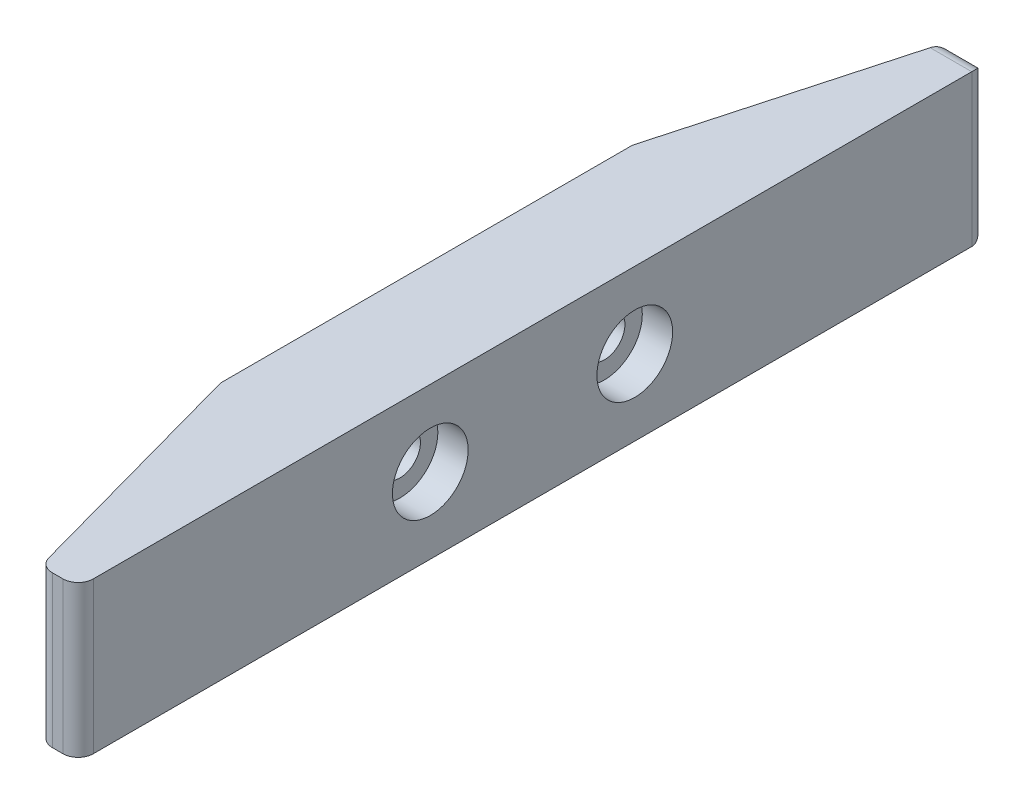
ISO-10303-21;
HEADER;
FILE_DESCRIPTION(('STEP AP214'),'2;1');
FILE_NAME('part.step','',(''),(''),'','','');
FILE_SCHEMA(('AUTOMOTIVE_DESIGN { 1 0 10303 214 1 1 1 1 }'));
ENDSEC;
DATA;
#1=APPLICATION_CONTEXT('core data for automotive mechanical design processes');
#2=APPLICATION_PROTOCOL_DEFINITION('international standard','automotive_design',2000,#1);
#3=PRODUCT_CONTEXT('',#1,'mechanical');
#4=PRODUCT('Part','Part','',(#3));
#5=PRODUCT_RELATED_PRODUCT_CATEGORY('part','',(#4));
#6=PRODUCT_DEFINITION_FORMATION('','',#4);
#7=PRODUCT_DEFINITION_CONTEXT('part definition',#1,'design');
#8=PRODUCT_DEFINITION('design','',#6,#7);
#9=PRODUCT_DEFINITION_SHAPE('','',#8);
#10=(LENGTH_UNIT() NAMED_UNIT(*) SI_UNIT(.MILLI.,.METRE.));
#11=(NAMED_UNIT(*) PLANE_ANGLE_UNIT() SI_UNIT($,.RADIAN.));
#12=(NAMED_UNIT(*) SI_UNIT($,.STERADIAN.) SOLID_ANGLE_UNIT());
#13=UNCERTAINTY_MEASURE_WITH_UNIT(LENGTH_MEASURE(1.E-05),#10,'distance_accuracy_value','');
#14=(GEOMETRIC_REPRESENTATION_CONTEXT(3) GLOBAL_UNCERTAINTY_ASSIGNED_CONTEXT((#13)) GLOBAL_UNIT_ASSIGNED_CONTEXT((#10,
#11,#12)) REPRESENTATION_CONTEXT('',''));
#15=CARTESIAN_POINT('',(0.,0.,0.));
#16=DIRECTION('',(0.,0.,1.));
#17=DIRECTION('',(1.,0.,0.));
#18=AXIS2_PLACEMENT_3D('',#15,#16,#17);
#19=CARTESIAN_POINT('',(10.,5.,6.75));
#20=DIRECTION('',(-1.,0.,0.));
#21=DIRECTION('',(0.,0.,1.));
#22=AXIS2_PLACEMENT_3D('',#19,#20,#21);
#23=CYLINDRICAL_SURFACE('',#22,1.35);
#24=CARTESIAN_POINT('',(0.,5.,6.75));
#25=DIRECTION('',(-1.,0.,0.));
#26=DIRECTION('',(0.,0.,-1.));
#27=AXIS2_PLACEMENT_3D('',#24,#25,#26);
#28=CIRCLE('',#27,1.35);
#29=CARTESIAN_POINT('',(0.,5.,5.4));
#30=VERTEX_POINT('',#29);
#31=EDGE_CURVE('E143',#30,#30,#28,.T.);
#32=ORIENTED_EDGE('',*,*,#31,.T.);
#33=EDGE_LOOP('',(#32));
#34=FACE_BOUND('',#33,.T.);
#35=CARTESIAN_POINT('',(5.00000000000001,5.,6.75));
#36=DIRECTION('',(1.,0.,0.));
#37=DIRECTION('',(0.,0.,-1.));
#38=AXIS2_PLACEMENT_3D('',#35,#36,#37);
#39=CIRCLE('',#38,1.35);
#40=CARTESIAN_POINT('',(5.00000000000001,5.,5.4));
#41=VERTEX_POINT('',#40);
#42=EDGE_CURVE('E48',#41,#41,#39,.F.);
#43=ORIENTED_EDGE('',*,*,#42,.F.);
#44=EDGE_LOOP('',(#43));
#45=FACE_BOUND('',#44,.T.);
#46=ADVANCED_FACE('F44',(#34,#45),#23,.F.);
#47=CARTESIAN_POINT('',(10.,5.,-6.75));
#48=DIRECTION('',(-1.,0.,0.));
#49=DIRECTION('',(0.,0.,1.));
#50=AXIS2_PLACEMENT_3D('',#47,#48,#49);
#51=CYLINDRICAL_SURFACE('',#50,1.35);
#52=CARTESIAN_POINT('',(0.,5.,-6.75));
#53=DIRECTION('',(-1.,0.,0.));
#54=DIRECTION('',(0.,0.,1.));
#55=AXIS2_PLACEMENT_3D('',#52,#53,#54);
#56=CIRCLE('',#55,1.35);
#57=CARTESIAN_POINT('',(0.,5.,-5.4));
#58=VERTEX_POINT('',#57);
#59=EDGE_CURVE('E176',#58,#58,#56,.T.);
#60=ORIENTED_EDGE('',*,*,#59,.T.);
#61=EDGE_LOOP('',(#60));
#62=FACE_BOUND('',#61,.T.);
#63=CARTESIAN_POINT('',(5.,5.,-6.75));
#64=DIRECTION('',(1.,0.,0.));
#65=DIRECTION('',(0.,0.,-1.));
#66=AXIS2_PLACEMENT_3D('',#63,#64,#65);
#67=CIRCLE('',#66,1.35);
#68=CARTESIAN_POINT('',(5.,5.,-8.1));
#69=VERTEX_POINT('',#68);
#70=EDGE_CURVE('E246',#69,#69,#67,.F.);
#71=ORIENTED_EDGE('',*,*,#70,.F.);
#72=EDGE_LOOP('',(#71));
#73=FACE_BOUND('',#72,.T.);
#74=ADVANCED_FACE('F303',(#62,#73),#51,.F.);
#75=CARTESIAN_POINT('',(0.,10.,-30.));
#76=DIRECTION('',(0.,0.,-1.));
#77=DIRECTION('',(-1.,0.,0.));
#78=AXIS2_PLACEMENT_3D('',#75,#76,#77);
#79=PLANE('',#78);
#80=DIRECTION('',(0.,1.,0.));
#81=VECTOR('',#80,1.);
#82=CARTESIAN_POINT('',(5.29184483020298,10.,-30.));
#83=LINE('',#82,#81);
#84=CARTESIAN_POINT('',(5.29184483020298,1.,-30.));
#85=VERTEX_POINT('',#84);
#86=CARTESIAN_POINT('',(5.29184483020298,9.,-30.));
#87=VERTEX_POINT('',#86);
#88=EDGE_CURVE('E188',#85,#87,#83,.T.);
#89=ORIENTED_EDGE('',*,*,#88,.T.);
#90=DIRECTION('',(1.,0.,0.));
#91=VECTOR('',#90,1.);
#92=CARTESIAN_POINT('',(0.,9.,-30.));
#93=LINE('',#92,#91);
#94=CARTESIAN_POINT('',(6.,9.,-30.));
#95=VERTEX_POINT('',#94);
#96=EDGE_CURVE('E191',#87,#95,#93,.T.);
#97=ORIENTED_EDGE('',*,*,#96,.T.);
#98=DIRECTION('',(0.,1.,0.));
#99=VECTOR('',#98,1.);
#100=CARTESIAN_POINT('',(6.,0.,-30.));
#101=LINE('',#100,#99);
#102=CARTESIAN_POINT('',(6.,1.,-30.));
#103=VERTEX_POINT('',#102);
#104=EDGE_CURVE('E182',#95,#103,#101,.F.);
#105=ORIENTED_EDGE('',*,*,#104,.T.);
#106=DIRECTION('',(1.,0.,0.));
#107=VECTOR('',#106,1.);
#108=CARTESIAN_POINT('',(4.53053049112299,1.,-30.));
#109=LINE('',#108,#107);
#110=EDGE_CURVE('E185',#103,#85,#109,.F.);
#111=ORIENTED_EDGE('',*,*,#110,.T.);
#112=EDGE_LOOP('',(#89,#97,#105,#111));
#113=FACE_BOUND('',#112,.T.);
#114=ADVANCED_FACE('F294',(#113),#79,.T.);
#115=CARTESIAN_POINT('',(0.,10.,0.));
#116=DIRECTION('',(-1.,0.,0.));
#117=DIRECTION('',(0.,0.,1.));
#118=AXIS2_PLACEMENT_3D('',#115,#116,#117);
#119=PLANE('',#118);
#120=DIRECTION('',(0.,1.,0.));
#121=VECTOR('',#120,1.);
#122=CARTESIAN_POINT('',(0.,-8.,-13.591085099465));
#123=LINE('',#122,#121);
#124=CARTESIAN_POINT('',(0.,0.,-13.591085099465));
#125=VERTEX_POINT('',#124);
#126=CARTESIAN_POINT('',(0.,10.,-13.591085099465));
#127=VERTEX_POINT('',#126);
#128=EDGE_CURVE('E132',#125,#127,#123,.T.);
#129=ORIENTED_EDGE('',*,*,#128,.F.);
#130=DIRECTION('',(0.,0.,-1.));
#131=VECTOR('',#130,1.);
#132=CARTESIAN_POINT('',(0.,0.,0.));
#133=LINE('',#132,#131);
#134=CARTESIAN_POINT('',(0.,0.,13.591085099465));
#135=VERTEX_POINT('',#134);
#136=EDGE_CURVE('E170',#135,#125,#133,.T.);
#137=ORIENTED_EDGE('',*,*,#136,.F.);
#138=DIRECTION('',(0.,1.,0.));
#139=VECTOR('',#138,1.);
#140=CARTESIAN_POINT('',(0.,-8.,13.591085099465));
#141=LINE('',#140,#139);
#142=CARTESIAN_POINT('',(0.,10.,13.591085099465));
#143=VERTEX_POINT('',#142);
#144=EDGE_CURVE('E155',#135,#143,#141,.T.);
#145=ORIENTED_EDGE('',*,*,#144,.T.);
#146=DIRECTION('',(0.,0.,-1.));
#147=VECTOR('',#146,1.);
#148=CARTESIAN_POINT('',(0.,10.,0.));
#149=LINE('',#148,#147);
#150=EDGE_CURVE('E151',#143,#127,#149,.T.);
#151=ORIENTED_EDGE('',*,*,#150,.T.);
#152=EDGE_LOOP('',(#129,#137,#145,#151));
#153=FACE_BOUND('',#152,.T.);
#154=ORIENTED_EDGE('',*,*,#59,.F.);
#155=EDGE_LOOP('',(#154));
#156=FACE_BOUND('',#155,.T.);
#157=ORIENTED_EDGE('',*,*,#31,.F.);
#158=EDGE_LOOP('',(#157));
#159=FACE_BOUND('',#158,.T.);
#160=ADVANCED_FACE('F158',(#153,#156,#159),#119,.T.);
#161=CARTESIAN_POINT('',(0.,10.,30.));
#162=DIRECTION('',(0.,0.,-1.));
#163=DIRECTION('',(-1.,0.,0.));
#164=AXIS2_PLACEMENT_3D('',#161,#162,#163);
#165=PLANE('',#164);
#166=DIRECTION('',(1.,0.,0.));
#167=VECTOR('',#166,1.);
#168=CARTESIAN_POINT('',(0.,0.,30.));
#169=LINE('',#168,#167);
#170=CARTESIAN_POINT('',(5.29184483020298,0.,30.));
#171=VERTEX_POINT('',#170);
#172=CARTESIAN_POINT('',(6.00000000000001,0.,30.));
#173=VERTEX_POINT('',#172);
#174=EDGE_CURVE('E163',#171,#173,#169,.T.);
#175=ORIENTED_EDGE('',*,*,#174,.T.);
#176=DIRECTION('',(0.,1.,0.));
#177=VECTOR('',#176,1.);
#178=CARTESIAN_POINT('',(6.00000000000001,10.,30.));
#179=LINE('',#178,#177);
#180=CARTESIAN_POINT('',(6.00000000000001,10.,30.));
#181=VERTEX_POINT('',#180);
#182=EDGE_CURVE('E54',#173,#181,#179,.T.);
#183=ORIENTED_EDGE('',*,*,#182,.T.);
#184=DIRECTION('',(1.,0.,0.));
#185=VECTOR('',#184,1.);
#186=CARTESIAN_POINT('',(0.,10.,30.));
#187=LINE('',#186,#185);
#188=CARTESIAN_POINT('',(5.29184483020298,10.,30.));
#189=VERTEX_POINT('',#188);
#190=EDGE_CURVE('E162',#189,#181,#187,.T.);
#191=ORIENTED_EDGE('',*,*,#190,.F.);
#192=DIRECTION('',(0.,1.,0.));
#193=VECTOR('',#192,1.);
#194=CARTESIAN_POINT('',(5.29184483020298,10.,30.));
#195=LINE('',#194,#193);
#196=EDGE_CURVE('E225',#189,#171,#195,.F.);
#197=ORIENTED_EDGE('',*,*,#196,.T.);
#198=EDGE_LOOP('',(#175,#183,#191,#197));
#199=FACE_BOUND('',#198,.T.);
#200=ADVANCED_FACE('F293',(#199),#165,.F.);
#201=CARTESIAN_POINT('',(0.,10.,0.));
#202=DIRECTION('',(0.,1.,0.));
#203=DIRECTION('',(0.,0.,1.));
#204=AXIS2_PLACEMENT_3D('',#201,#202,#203);
#205=PLANE('',#204);
#206=DIRECTION('',(0.,0.,1.));
#207=VECTOR('',#206,1.);
#208=CARTESIAN_POINT('',(7.,10.,-30.));
#209=LINE('',#208,#207);
#210=CARTESIAN_POINT('',(7.,10.,-29.));
#211=VERTEX_POINT('',#210);
#212=CARTESIAN_POINT('',(7.00000000000001,10.,29.));
#213=VERTEX_POINT('',#212);
#214=EDGE_CURVE('E245',#211,#213,#209,.T.);
#215=ORIENTED_EDGE('',*,*,#214,.F.);
#216=DIRECTION('',(1.,0.,0.));
#217=VECTOR('',#216,1.);
#218=CARTESIAN_POINT('',(0.,10.,-29.));
#219=LINE('',#218,#217);
#220=CARTESIAN_POINT('',(4.25442871848383,10.,-29.));
#221=VERTEX_POINT('',#220);
#222=EDGE_CURVE('E153',#211,#221,#219,.F.);
#223=ORIENTED_EDGE('',*,*,#222,.T.);
#224=DIRECTION('',(0.26614370985778,0.,-0.963933361650658));
#225=VECTOR('',#224,1.);
#226=CARTESIAN_POINT('',(0.,10.,-13.591085099465));
#227=LINE('',#226,#225);
#228=EDGE_CURVE('E135',#127,#221,#227,.T.);
#229=ORIENTED_EDGE('',*,*,#228,.F.);
#230=ORIENTED_EDGE('',*,*,#150,.F.);
#231=DIRECTION('',(-0.26614370985778,0.,-0.963933361650658));
#232=VECTOR('',#231,1.);
#233=CARTESIAN_POINT('',(0.,10.,13.591085099465));
#234=LINE('',#233,#232);
#235=CARTESIAN_POINT('',(4.32791146855232,10.,29.2661437098578));
#236=VERTEX_POINT('',#235);
#237=EDGE_CURVE('E277',#236,#143,#234,.T.);
#238=ORIENTED_EDGE('',*,*,#237,.F.);
#239=CARTESIAN_POINT('',(5.29184483020298,10.,29.));
#240=DIRECTION('',(0.,1.,0.));
#241=DIRECTION('',(0.,0.,1.));
#242=AXIS2_PLACEMENT_3D('',#239,#240,#241);
#243=CIRCLE('',#242,1.);
#244=EDGE_CURVE('E195',#236,#189,#243,.T.);
#245=ORIENTED_EDGE('',*,*,#244,.T.);
#246=ORIENTED_EDGE('',*,*,#190,.T.);
#247=CARTESIAN_POINT('',(6.00000000000001,10.,29.));
#248=DIRECTION('',(0.,1.,0.));
#249=DIRECTION('',(0.,0.,1.));
#250=AXIS2_PLACEMENT_3D('',#247,#248,#249);
#251=CIRCLE('',#250,1.);
#252=EDGE_CURVE('E198',#181,#213,#251,.T.);
#253=ORIENTED_EDGE('',*,*,#252,.T.);
#254=EDGE_LOOP('',(#215,#223,#229,#230,#238,#245,#246,#253));
#255=FACE_BOUND('',#254,.T.);
#256=ADVANCED_FACE('F149',(#255),#205,.T.);
#257=CARTESIAN_POINT('',(0.,0.,0.));
#258=DIRECTION('',(0.,1.,0.));
#259=DIRECTION('',(0.,0.,1.));
#260=AXIS2_PLACEMENT_3D('',#257,#258,#259);
#261=PLANE('',#260);
#262=DIRECTION('',(0.26614370985778,0.,-0.963933361650658));
#263=VECTOR('',#262,1.);
#264=CARTESIAN_POINT('',(-3.48672222120223,0.,-0.962690185974315));
#265=LINE('',#264,#263);
#266=CARTESIAN_POINT('',(4.25442871848382,0.,-29.));
#267=VERTEX_POINT('',#266);
#268=EDGE_CURVE('E137',#125,#267,#265,.T.);
#269=ORIENTED_EDGE('',*,*,#268,.T.);
#270=DIRECTION('',(1.,0.,0.));
#271=VECTOR('',#270,1.);
#272=CARTESIAN_POINT('',(7.,0.,-29.));
#273=LINE('',#272,#271);
#274=CARTESIAN_POINT('',(7.,0.,-29.));
#275=VERTEX_POINT('',#274);
#276=EDGE_CURVE('E216',#267,#275,#273,.T.);
#277=ORIENTED_EDGE('',*,*,#276,.T.);
#278=DIRECTION('',(0.,0.,1.));
#279=VECTOR('',#278,1.);
#280=CARTESIAN_POINT('',(7.,0.,0.));
#281=LINE('',#280,#279);
#282=CARTESIAN_POINT('',(7.00000000000001,0.,29.));
#283=VERTEX_POINT('',#282);
#284=EDGE_CURVE('E275',#275,#283,#281,.T.);
#285=ORIENTED_EDGE('',*,*,#284,.T.);
#286=CARTESIAN_POINT('',(6.00000000000001,0.,29.));
#287=DIRECTION('',(0.,1.,0.));
#288=DIRECTION('',(0.,0.,1.));
#289=AXIS2_PLACEMENT_3D('',#286,#287,#288);
#290=CIRCLE('',#289,1.);
#291=EDGE_CURVE('E68',#283,#173,#290,.F.);
#292=ORIENTED_EDGE('',*,*,#291,.T.);
#293=ORIENTED_EDGE('',*,*,#174,.F.);
#294=CARTESIAN_POINT('',(5.29184483020298,0.,29.));
#295=DIRECTION('',(0.,1.,0.));
#296=DIRECTION('',(0.,0.,1.));
#297=AXIS2_PLACEMENT_3D('',#294,#295,#296);
#298=CIRCLE('',#297,1.);
#299=CARTESIAN_POINT('',(4.32791146855232,0.,29.2661437098578));
#300=VERTEX_POINT('',#299);
#301=EDGE_CURVE('E62',#171,#300,#298,.F.);
#302=ORIENTED_EDGE('',*,*,#301,.T.);
#303=DIRECTION('',(-0.26614370985778,0.,-0.963933361650658));
#304=VECTOR('',#303,1.);
#305=CARTESIAN_POINT('',(-3.48672222120223,0.,0.962690185974315));
#306=LINE('',#305,#304);
#307=EDGE_CURVE('E168',#300,#135,#306,.T.);
#308=ORIENTED_EDGE('',*,*,#307,.T.);
#309=ORIENTED_EDGE('',*,*,#136,.T.);
#310=EDGE_LOOP('',(#269,#277,#285,#292,#293,#302,#308,#309));
#311=FACE_BOUND('',#310,.T.);
#312=ADVANCED_FACE('F316',(#311),#261,.F.);
#313=CARTESIAN_POINT('',(0.,-8.,13.591085099465));
#314=DIRECTION('',(0.963933361650658,0.,-0.26614370985778));
#315=DIRECTION('',(-0.26614370985778,0.,-0.963933361650658));
#316=AXIS2_PLACEMENT_3D('',#313,#314,#315);
#317=PLANE('',#316);
#318=ORIENTED_EDGE('',*,*,#307,.F.);
#319=DIRECTION('',(0.,1.,0.));
#320=VECTOR('',#319,1.);
#321=CARTESIAN_POINT('',(4.32791146855232,-8.,29.2661437098578));
#322=LINE('',#321,#320);
#323=EDGE_CURVE('E11',#300,#236,#322,.T.);
#324=ORIENTED_EDGE('',*,*,#323,.T.);
#325=ORIENTED_EDGE('',*,*,#237,.T.);
#326=ORIENTED_EDGE('',*,*,#144,.F.);
#327=EDGE_LOOP('',(#318,#324,#325,#326));
#328=FACE_BOUND('',#327,.T.);
#329=ADVANCED_FACE('F318',(#328),#317,.F.);
#330=CARTESIAN_POINT('',(0.,-8.,-13.591085099465));
#331=DIRECTION('',(0.963933361650658,0.,0.26614370985778));
#332=DIRECTION('',(0.26614370985778,0.,-0.963933361650658));
#333=AXIS2_PLACEMENT_3D('',#330,#331,#332);
#334=PLANE('',#333);
#335=ORIENTED_EDGE('',*,*,#228,.T.);
#336=CARTESIAN_POINT('',(4.25442871848383,9.,-29.));
#337=DIRECTION('',(0.963933361650658,0.,0.26614370985778));
#338=DIRECTION('',(0.26614370985778,0.,-0.963933361650658));
#339=AXIS2_PLACEMENT_3D('',#336,#337,#338);
#340=ELLIPSE('',#339,1.03741611171916,1.);
#341=CARTESIAN_POINT('',(4.32791146855232,9.96393336165066,-29.2661437098578));
#342=VERTEX_POINT('',#341);
#343=EDGE_CURVE('E209',#221,#342,#340,.F.);
#344=ORIENTED_EDGE('',*,*,#343,.T.);
#345=DIRECTION('',(0.,1.,0.));
#346=VECTOR('',#345,1.);
#347=CARTESIAN_POINT('',(4.32791146855232,0.,-29.2661437098578));
#348=LINE('',#347,#346);
#349=CARTESIAN_POINT('',(4.32791146855232,0.0360666383493421,-29.2661437098578));
#350=VERTEX_POINT('',#349);
#351=EDGE_CURVE('E206',#342,#350,#348,.F.);
#352=ORIENTED_EDGE('',*,*,#351,.T.);
#353=CARTESIAN_POINT('',(4.25442871848383,1.,-29.));
#354=DIRECTION('',(0.963933361650658,0.,0.26614370985778));
#355=DIRECTION('',(-0.26614370985778,0.,0.963933361650658));
#356=AXIS2_PLACEMENT_3D('',#353,#354,#355);
#357=ELLIPSE('',#356,1.03741611171916,1.);
#358=EDGE_CURVE('E203',#350,#267,#357,.F.);
#359=ORIENTED_EDGE('',*,*,#358,.T.);
#360=ORIENTED_EDGE('',*,*,#268,.F.);
#361=ORIENTED_EDGE('',*,*,#128,.T.);
#362=EDGE_LOOP('',(#335,#344,#352,#359,#360,#361));
#363=FACE_BOUND('',#362,.T.);
#364=ADVANCED_FACE('F134',(#363),#334,.F.);
#365=CARTESIAN_POINT('',(7.,-16.,-30.));
#366=DIRECTION('',(-1.,0.,0.));
#367=DIRECTION('',(0.,0.,1.));
#368=AXIS2_PLACEMENT_3D('',#365,#366,#367);
#369=PLANE('',#368);
#370=CARTESIAN_POINT('',(7.00000000000001,5.,6.75));
#371=DIRECTION('',(1.,0.,0.));
#372=DIRECTION('',(0.,0.,-1.));
#373=AXIS2_PLACEMENT_3D('',#370,#371,#372);
#374=CIRCLE('',#373,2.5);
#375=CARTESIAN_POINT('',(7.00000000000001,5.,4.25));
#376=VERTEX_POINT('',#375);
#377=EDGE_CURVE('E256',#376,#376,#374,.T.);
#378=ORIENTED_EDGE('',*,*,#377,.F.);
#379=EDGE_LOOP('',(#378));
#380=FACE_BOUND('',#379,.T.);
#381=CARTESIAN_POINT('',(7.,5.,-6.75));
#382=DIRECTION('',(1.,0.,0.));
#383=DIRECTION('',(0.,0.,-1.));
#384=AXIS2_PLACEMENT_3D('',#381,#382,#383);
#385=CIRCLE('',#384,2.5);
#386=CARTESIAN_POINT('',(7.,5.,-9.25));
#387=VERTEX_POINT('',#386);
#388=EDGE_CURVE('E268',#387,#387,#385,.T.);
#389=ORIENTED_EDGE('',*,*,#388,.F.);
#390=EDGE_LOOP('',(#389));
#391=FACE_BOUND('',#390,.T.);
#392=ORIENTED_EDGE('',*,*,#284,.F.);
#393=DIRECTION('',(0.,1.,0.));
#394=VECTOR('',#393,1.);
#395=CARTESIAN_POINT('',(7.,10.,-29.));
#396=LINE('',#395,#394);
#397=EDGE_CURVE('E222',#275,#211,#396,.T.);
#398=ORIENTED_EDGE('',*,*,#397,.T.);
#399=ORIENTED_EDGE('',*,*,#214,.T.);
#400=DIRECTION('',(0.,1.,0.));
#401=VECTOR('',#400,1.);
#402=CARTESIAN_POINT('',(7.00000000000001,-16.,29.));
#403=LINE('',#402,#401);
#404=EDGE_CURVE('E219',#213,#283,#403,.F.);
#405=ORIENTED_EDGE('',*,*,#404,.T.);
#406=EDGE_LOOP('',(#392,#398,#399,#405));
#407=FACE_BOUND('',#406,.T.);
#408=ADVANCED_FACE('F338',(#380,#391,#407),#369,.F.);
#409=CARTESIAN_POINT('',(0.,1.,-29.));
#410=DIRECTION('',(-1.,0.,0.));
#411=DIRECTION('',(0.,0.,1.));
#412=AXIS2_PLACEMENT_3D('',#409,#410,#411);
#413=CYLINDRICAL_SURFACE('',#412,1.);
#414=ORIENTED_EDGE('',*,*,#276,.F.);
#415=ORIENTED_EDGE('',*,*,#358,.F.);
#416=CARTESIAN_POINT('',(5.29184483020298,1.,-29.));
#417=DIRECTION('',(-0.707106781186548,0.707106781186547,0.));
#418=DIRECTION('',(-0.707106781186548,-0.707106781186547,0.));
#419=AXIS2_PLACEMENT_3D('',#416,#417,#418);
#420=ELLIPSE('',#419,1.41421356237309,1.);
#421=EDGE_CURVE('E242',#85,#350,#420,.T.);
#422=ORIENTED_EDGE('',*,*,#421,.F.);
#423=ORIENTED_EDGE('',*,*,#110,.F.);
#424=CARTESIAN_POINT('',(6.,1.,-29.));
#425=DIRECTION('',(-0.707106781186547,-0.707106781186547,0.));
#426=DIRECTION('',(0.707106781186547,-0.707106781186547,0.));
#427=AXIS2_PLACEMENT_3D('',#424,#425,#426);
#428=ELLIPSE('',#427,1.41421356237309,1.);
#429=EDGE_CURVE('E238',#275,#103,#428,.F.);
#430=ORIENTED_EDGE('',*,*,#429,.F.);
#431=EDGE_LOOP('',(#414,#415,#422,#423,#430));
#432=FACE_BOUND('',#431,.T.);
#433=ADVANCED_FACE('F329',(#432),#413,.T.);
#434=CARTESIAN_POINT('',(5.29184483020298,10.,-29.));
#435=DIRECTION('',(0.,-1.,0.));
#436=DIRECTION('',(0.,0.,-1.));
#437=AXIS2_PLACEMENT_3D('',#434,#435,#436);
#438=CYLINDRICAL_SURFACE('',#437,1.);
#439=ORIENTED_EDGE('',*,*,#421,.T.);
#440=ORIENTED_EDGE('',*,*,#351,.F.);
#441=CARTESIAN_POINT('',(5.29184483020298,9.,-29.));
#442=DIRECTION('',(-0.707106781186548,-0.707106781186547,0.));
#443=DIRECTION('',(0.707106781186548,-0.707106781186547,0.));
#444=AXIS2_PLACEMENT_3D('',#441,#442,#443);
#445=ELLIPSE('',#444,1.41421356237309,1.);
#446=EDGE_CURVE('E234',#87,#342,#445,.F.);
#447=ORIENTED_EDGE('',*,*,#446,.F.);
#448=ORIENTED_EDGE('',*,*,#88,.F.);
#449=EDGE_LOOP('',(#439,#440,#447,#448));
#450=FACE_BOUND('',#449,.T.);
#451=ADVANCED_FACE('F346',(#450),#438,.T.);
#452=CARTESIAN_POINT('',(6.,-16.,-29.));
#453=DIRECTION('',(0.,-1.,0.));
#454=DIRECTION('',(0.,0.,-1.));
#455=AXIS2_PLACEMENT_3D('',#452,#453,#454);
#456=CYLINDRICAL_SURFACE('',#455,1.);
#457=ORIENTED_EDGE('',*,*,#429,.T.);
#458=ORIENTED_EDGE('',*,*,#104,.F.);
#459=CARTESIAN_POINT('',(6.,9.,-29.));
#460=DIRECTION('',(0.707106781186547,-0.707106781186547,0.));
#461=DIRECTION('',(-0.707106781186547,-0.707106781186547,0.));
#462=AXIS2_PLACEMENT_3D('',#459,#460,#461);
#463=ELLIPSE('',#462,1.41421356237309,1.);
#464=EDGE_CURVE('E231',#211,#95,#463,.F.);
#465=ORIENTED_EDGE('',*,*,#464,.F.);
#466=ORIENTED_EDGE('',*,*,#397,.F.);
#467=EDGE_LOOP('',(#457,#458,#465,#466));
#468=FACE_BOUND('',#467,.T.);
#469=ADVANCED_FACE('F336',(#468),#456,.T.);
#470=CARTESIAN_POINT('',(0.,9.,-29.));
#471=DIRECTION('',(1.,0.,0.));
#472=DIRECTION('',(0.,0.,-1.));
#473=AXIS2_PLACEMENT_3D('',#470,#471,#472);
#474=CYLINDRICAL_SURFACE('',#473,1.);
#475=ORIENTED_EDGE('',*,*,#343,.F.);
#476=ORIENTED_EDGE('',*,*,#222,.F.);
#477=ORIENTED_EDGE('',*,*,#464,.T.);
#478=ORIENTED_EDGE('',*,*,#96,.F.);
#479=ORIENTED_EDGE('',*,*,#446,.T.);
#480=EDGE_LOOP('',(#475,#476,#477,#478,#479));
#481=FACE_BOUND('',#480,.T.);
#482=ADVANCED_FACE('F341',(#481),#474,.T.);
#483=CARTESIAN_POINT('',(6.00000000000001,10.,29.));
#484=DIRECTION('',(0.,1.,0.));
#485=DIRECTION('',(0.,0.,1.));
#486=AXIS2_PLACEMENT_3D('',#483,#484,#485);
#487=CYLINDRICAL_SURFACE('',#486,1.);
#488=ORIENTED_EDGE('',*,*,#291,.F.);
#489=ORIENTED_EDGE('',*,*,#404,.F.);
#490=ORIENTED_EDGE('',*,*,#252,.F.);
#491=ORIENTED_EDGE('',*,*,#182,.F.);
#492=EDGE_LOOP('',(#488,#489,#490,#491));
#493=FACE_BOUND('',#492,.T.);
#494=ADVANCED_FACE('F357',(#493),#487,.T.);
#495=CARTESIAN_POINT('',(5.29184483020298,-8.,29.));
#496=DIRECTION('',(0.,1.,0.));
#497=DIRECTION('',(0.,0.,1.));
#498=AXIS2_PLACEMENT_3D('',#495,#496,#497);
#499=CYLINDRICAL_SURFACE('',#498,1.);
#500=ORIENTED_EDGE('',*,*,#301,.F.);
#501=ORIENTED_EDGE('',*,*,#196,.F.);
#502=ORIENTED_EDGE('',*,*,#244,.F.);
#503=ORIENTED_EDGE('',*,*,#323,.F.);
#504=EDGE_LOOP('',(#500,#501,#502,#503));
#505=FACE_BOUND('',#504,.T.);
#506=ADVANCED_FACE('F46',(#505),#499,.T.);
#507=CARTESIAN_POINT('',(5.,5.,-6.75));
#508=DIRECTION('',(1.,0.,0.));
#509=DIRECTION('',(0.,0.,-1.));
#510=AXIS2_PLACEMENT_3D('',#507,#508,#509);
#511=PLANE('',#510);
#512=CARTESIAN_POINT('',(5.,5.,-6.75));
#513=DIRECTION('',(1.,0.,0.));
#514=DIRECTION('',(0.,0.,-1.));
#515=AXIS2_PLACEMENT_3D('',#512,#513,#514);
#516=CIRCLE('',#515,2.5);
#517=CARTESIAN_POINT('',(5.,5.,-9.25));
#518=VERTEX_POINT('',#517);
#519=EDGE_CURVE('E262',#518,#518,#516,.T.);
#520=ORIENTED_EDGE('',*,*,#519,.T.);
#521=EDGE_LOOP('',(#520));
#522=FACE_BOUND('',#521,.T.);
#523=ORIENTED_EDGE('',*,*,#70,.T.);
#524=EDGE_LOOP('',(#523));
#525=FACE_BOUND('',#524,.T.);
#526=ADVANCED_FACE('F364',(#522,#525),#511,.T.);
#527=CARTESIAN_POINT('',(5.,5.,-6.75));
#528=DIRECTION('',(1.,0.,0.));
#529=DIRECTION('',(0.,0.,-1.));
#530=AXIS2_PLACEMENT_3D('',#527,#528,#529);
#531=CYLINDRICAL_SURFACE('',#530,2.5);
#532=ORIENTED_EDGE('',*,*,#519,.F.);
#533=EDGE_LOOP('',(#532));
#534=FACE_BOUND('',#533,.T.);
#535=ORIENTED_EDGE('',*,*,#388,.T.);
#536=EDGE_LOOP('',(#535));
#537=FACE_BOUND('',#536,.T.);
#538=ADVANCED_FACE('F484',(#534,#537),#531,.F.);
#539=CARTESIAN_POINT('',(5.00000000000001,5.,6.75));
#540=DIRECTION('',(1.,0.,0.));
#541=DIRECTION('',(0.,0.,-1.));
#542=AXIS2_PLACEMENT_3D('',#539,#540,#541);
#543=PLANE('',#542);
#544=CARTESIAN_POINT('',(5.00000000000001,5.,6.75));
#545=DIRECTION('',(1.,0.,0.));
#546=DIRECTION('',(0.,0.,-1.));
#547=AXIS2_PLACEMENT_3D('',#544,#545,#546);
#548=CIRCLE('',#547,2.5);
#549=CARTESIAN_POINT('',(5.00000000000001,5.,4.25));
#550=VERTEX_POINT('',#549);
#551=EDGE_CURVE('E249',#550,#550,#548,.T.);
#552=ORIENTED_EDGE('',*,*,#551,.T.);
#553=EDGE_LOOP('',(#552));
#554=FACE_BOUND('',#553,.T.);
#555=ORIENTED_EDGE('',*,*,#42,.T.);
#556=EDGE_LOOP('',(#555));
#557=FACE_BOUND('',#556,.T.);
#558=ADVANCED_FACE('F496',(#554,#557),#543,.T.);
#559=CARTESIAN_POINT('',(5.00000000000001,5.,6.75));
#560=DIRECTION('',(1.,0.,0.));
#561=DIRECTION('',(0.,0.,-1.));
#562=AXIS2_PLACEMENT_3D('',#559,#560,#561);
#563=CYLINDRICAL_SURFACE('',#562,2.5);
#564=ORIENTED_EDGE('',*,*,#551,.F.);
#565=EDGE_LOOP('',(#564));
#566=FACE_BOUND('',#565,.T.);
#567=ORIENTED_EDGE('',*,*,#377,.T.);
#568=EDGE_LOOP('',(#567));
#569=FACE_BOUND('',#568,.T.);
#570=ADVANCED_FACE('F506',(#566,#569),#563,.F.);
#571=CLOSED_SHELL('',(#46,#74,#114,#160,#200,#256,#312,#329,#364,#408,#433,#451,#469,#482,#494,
#506,#526,#538,#558,#570));
#572=MANIFOLD_SOLID_BREP('B2',#571);
#573=ADVANCED_BREP_SHAPE_REPRESENTATION('',(#18,#572),#14);
#574=SHAPE_DEFINITION_REPRESENTATION(#9,#573);
ENDSEC;
END-ISO-10303-21;
